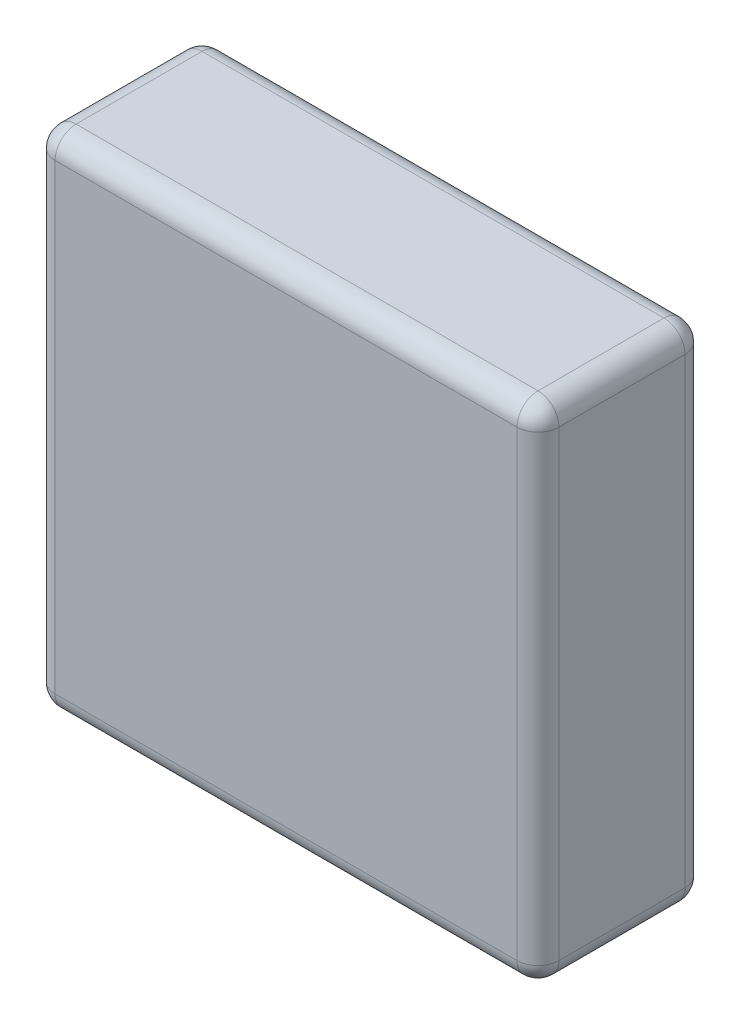
ISO-10303-21;
HEADER;
FILE_DESCRIPTION(('STEP AP214'),'2;1');
FILE_NAME('part.step','',(''),(''),'','','');
FILE_SCHEMA(('AUTOMOTIVE_DESIGN { 1 0 10303 214 1 1 1 1 }'));
ENDSEC;
DATA;
#1=APPLICATION_CONTEXT('core data for automotive mechanical design processes');
#2=APPLICATION_PROTOCOL_DEFINITION('international standard','automotive_design',2000,#1);
#3=PRODUCT_CONTEXT('',#1,'mechanical');
#4=PRODUCT('Part','Part','',(#3));
#5=PRODUCT_RELATED_PRODUCT_CATEGORY('part','',(#4));
#6=PRODUCT_DEFINITION_FORMATION('','',#4);
#7=PRODUCT_DEFINITION_CONTEXT('part definition',#1,'design');
#8=PRODUCT_DEFINITION('design','',#6,#7);
#9=PRODUCT_DEFINITION_SHAPE('','',#8);
#10=(LENGTH_UNIT() NAMED_UNIT(*) SI_UNIT(.MILLI.,.METRE.));
#11=(NAMED_UNIT(*) PLANE_ANGLE_UNIT() SI_UNIT($,.RADIAN.));
#12=(NAMED_UNIT(*) SI_UNIT($,.STERADIAN.) SOLID_ANGLE_UNIT());
#13=UNCERTAINTY_MEASURE_WITH_UNIT(LENGTH_MEASURE(1.E-05),#10,'distance_accuracy_value','');
#14=(GEOMETRIC_REPRESENTATION_CONTEXT(3) GLOBAL_UNCERTAINTY_ASSIGNED_CONTEXT((#13)) GLOBAL_UNIT_ASSIGNED_CONTEXT((#10,
#11,#12)) REPRESENTATION_CONTEXT('',''));
#15=CARTESIAN_POINT('',(0.,0.,0.));
#16=DIRECTION('',(0.,0.,1.));
#17=DIRECTION('',(1.,0.,0.));
#18=AXIS2_PLACEMENT_3D('',#15,#16,#17);
#19=CARTESIAN_POINT('',(0.,0.,40.));
#20=DIRECTION('',(1.,0.,0.));
#21=DIRECTION('',(0.,1.,0.));
#22=AXIS2_PLACEMENT_3D('',#19,#20,#21);
#23=PLANE('',#22);
#24=DIRECTION('',(0.,0.,-1.));
#25=VECTOR('',#24,1.);
#26=CARTESIAN_POINT('',(0.,-5.,40.));
#27=LINE('',#26,#25);
#28=CARTESIAN_POINT('',(0.,-5.,35.));
#29=VERTEX_POINT('',#28);
#30=CARTESIAN_POINT('',(0.,-5.,5.));
#31=VERTEX_POINT('',#30);
#32=EDGE_CURVE('E205',#29,#31,#27,.T.);
#33=ORIENTED_EDGE('',*,*,#32,.T.);
#34=DIRECTION('',(0.,-1.,0.));
#35=VECTOR('',#34,1.);
#36=CARTESIAN_POINT('',(0.,0.,5.));
#37=LINE('',#36,#35);
#38=CARTESIAN_POINT('',(0.,-115.,5.));
#39=VERTEX_POINT('',#38);
#40=EDGE_CURVE('E208',#31,#39,#37,.T.);
#41=ORIENTED_EDGE('',*,*,#40,.T.);
#42=DIRECTION('',(0.,0.,-1.));
#43=VECTOR('',#42,1.);
#44=CARTESIAN_POINT('',(0.,-115.,40.));
#45=LINE('',#44,#43);
#46=CARTESIAN_POINT('',(0.,-115.,35.));
#47=VERTEX_POINT('',#46);
#48=EDGE_CURVE('E203',#39,#47,#45,.F.);
#49=ORIENTED_EDGE('',*,*,#48,.T.);
#50=DIRECTION('',(0.,-1.,0.));
#51=VECTOR('',#50,1.);
#52=CARTESIAN_POINT('',(0.,0.,35.));
#53=LINE('',#52,#51);
#54=EDGE_CURVE('E201',#47,#29,#53,.F.);
#55=ORIENTED_EDGE('',*,*,#54,.T.);
#56=EDGE_LOOP('',(#33,#41,#49,#55));
#57=FACE_BOUND('',#56,.T.);
#58=ADVANCED_FACE('F43',(#57),#23,.F.);
#59=CARTESIAN_POINT('',(0.,-120.,40.));
#60=DIRECTION('',(0.,1.,0.));
#61=DIRECTION('',(0.,0.,1.));
#62=AXIS2_PLACEMENT_3D('',#59,#60,#61);
#63=PLANE('',#62);
#64=DIRECTION('',(1.,0.,0.));
#65=VECTOR('',#64,1.);
#66=CARTESIAN_POINT('',(0.,-120.,5.));
#67=LINE('',#66,#65);
#68=CARTESIAN_POINT('',(5.00000000000001,-120.,5.));
#69=VERTEX_POINT('',#68);
#70=CARTESIAN_POINT('',(115.,-120.,5.));
#71=VERTEX_POINT('',#70);
#72=EDGE_CURVE('E143',#69,#71,#67,.T.);
#73=ORIENTED_EDGE('',*,*,#72,.T.);
#74=DIRECTION('',(0.,0.,-1.));
#75=VECTOR('',#74,1.);
#76=CARTESIAN_POINT('',(115.,-120.,40.));
#77=LINE('',#76,#75);
#78=CARTESIAN_POINT('',(115.,-120.,35.));
#79=VERTEX_POINT('',#78);
#80=EDGE_CURVE('E139',#71,#79,#77,.F.);
#81=ORIENTED_EDGE('',*,*,#80,.T.);
#82=DIRECTION('',(1.,0.,0.));
#83=VECTOR('',#82,1.);
#84=CARTESIAN_POINT('',(0.,-120.,35.));
#85=LINE('',#84,#83);
#86=CARTESIAN_POINT('',(5.00000000000001,-120.,35.));
#87=VERTEX_POINT('',#86);
#88=EDGE_CURVE('E131',#79,#87,#85,.F.);
#89=ORIENTED_EDGE('',*,*,#88,.T.);
#90=DIRECTION('',(0.,0.,-1.));
#91=VECTOR('',#90,1.);
#92=CARTESIAN_POINT('',(5.00000000000001,-120.,40.));
#93=LINE('',#92,#91);
#94=EDGE_CURVE('E136',#87,#69,#93,.T.);
#95=ORIENTED_EDGE('',*,*,#94,.T.);
#96=EDGE_LOOP('',(#73,#81,#89,#95));
#97=FACE_BOUND('',#96,.T.);
#98=ADVANCED_FACE('F134',(#97),#63,.F.);
#99=CARTESIAN_POINT('',(120.,0.,40.));
#100=DIRECTION('',(-1.,0.,0.));
#101=DIRECTION('',(0.,-1.,0.));
#102=AXIS2_PLACEMENT_3D('',#99,#100,#101);
#103=PLANE('',#102);
#104=DIRECTION('',(0.,0.,-1.));
#105=VECTOR('',#104,1.);
#106=CARTESIAN_POINT('',(120.,-5.,40.));
#107=LINE('',#106,#105);
#108=CARTESIAN_POINT('',(120.,-5.,5.));
#109=VERTEX_POINT('',#108);
#110=CARTESIAN_POINT('',(120.,-5.,35.));
#111=VERTEX_POINT('',#110);
#112=EDGE_CURVE('E63',#109,#111,#107,.F.);
#113=ORIENTED_EDGE('',*,*,#112,.T.);
#114=DIRECTION('',(0.,1.,0.));
#115=VECTOR('',#114,1.);
#116=CARTESIAN_POINT('',(120.,-120.,35.));
#117=LINE('',#116,#115);
#118=CARTESIAN_POINT('',(120.,-115.,35.));
#119=VERTEX_POINT('',#118);
#120=EDGE_CURVE('E11',#111,#119,#117,.F.);
#121=ORIENTED_EDGE('',*,*,#120,.T.);
#122=DIRECTION('',(0.,0.,-1.));
#123=VECTOR('',#122,1.);
#124=CARTESIAN_POINT('',(120.,-115.,40.));
#125=LINE('',#124,#123);
#126=CARTESIAN_POINT('',(120.,-115.,5.));
#127=VERTEX_POINT('',#126);
#128=EDGE_CURVE('E52',#119,#127,#125,.T.);
#129=ORIENTED_EDGE('',*,*,#128,.T.);
#130=DIRECTION('',(0.,1.,0.));
#131=VECTOR('',#130,1.);
#132=CARTESIAN_POINT('',(120.,0.,5.));
#133=LINE('',#132,#131);
#134=EDGE_CURVE('E210',#127,#109,#133,.T.);
#135=ORIENTED_EDGE('',*,*,#134,.T.);
#136=EDGE_LOOP('',(#113,#121,#129,#135));
#137=FACE_BOUND('',#136,.T.);
#138=ADVANCED_FACE('F280',(#137),#103,.F.);
#139=CARTESIAN_POINT('',(0.,0.,40.));
#140=DIRECTION('',(0.,-1.,0.));
#141=DIRECTION('',(0.,0.,-1.));
#142=AXIS2_PLACEMENT_3D('',#139,#140,#141);
#143=PLANE('',#142);
#144=DIRECTION('',(0.,0.,-1.));
#145=VECTOR('',#144,1.);
#146=CARTESIAN_POINT('',(5.,0.,40.));
#147=LINE('',#146,#145);
#148=CARTESIAN_POINT('',(5.,0.,5.));
#149=VERTEX_POINT('',#148);
#150=CARTESIAN_POINT('',(5.,0.,35.));
#151=VERTEX_POINT('',#150);
#152=EDGE_CURVE('E196',#149,#151,#147,.F.);
#153=ORIENTED_EDGE('',*,*,#152,.T.);
#154=DIRECTION('',(-1.,0.,0.));
#155=VECTOR('',#154,1.);
#156=CARTESIAN_POINT('',(120.,0.,35.));
#157=LINE('',#156,#155);
#158=CARTESIAN_POINT('',(115.,0.,35.));
#159=VERTEX_POINT('',#158);
#160=EDGE_CURVE('E198',#151,#159,#157,.F.);
#161=ORIENTED_EDGE('',*,*,#160,.T.);
#162=DIRECTION('',(0.,0.,-1.));
#163=VECTOR('',#162,1.);
#164=CARTESIAN_POINT('',(115.,0.,40.));
#165=LINE('',#164,#163);
#166=CARTESIAN_POINT('',(115.,0.,5.));
#167=VERTEX_POINT('',#166);
#168=EDGE_CURVE('E194',#159,#167,#165,.T.);
#169=ORIENTED_EDGE('',*,*,#168,.T.);
#170=DIRECTION('',(-1.,0.,0.));
#171=VECTOR('',#170,1.);
#172=CARTESIAN_POINT('',(0.,0.,5.));
#173=LINE('',#172,#171);
#174=EDGE_CURVE('E192',#167,#149,#173,.T.);
#175=ORIENTED_EDGE('',*,*,#174,.T.);
#176=EDGE_LOOP('',(#153,#161,#169,#175));
#177=FACE_BOUND('',#176,.T.);
#178=ADVANCED_FACE('F303',(#177),#143,.F.);
#179=CARTESIAN_POINT('',(0.,0.,40.));
#180=DIRECTION('',(0.,0.,1.));
#181=DIRECTION('',(1.,0.,0.));
#182=AXIS2_PLACEMENT_3D('',#179,#180,#181);
#183=PLANE('',#182);
#184=DIRECTION('',(-1.,0.,0.));
#185=VECTOR('',#184,1.);
#186=CARTESIAN_POINT('',(0.,-5.,40.));
#187=LINE('',#186,#185);
#188=CARTESIAN_POINT('',(115.,-5.,40.));
#189=VERTEX_POINT('',#188);
#190=CARTESIAN_POINT('',(5.,-5.,40.));
#191=VERTEX_POINT('',#190);
#192=EDGE_CURVE('E187',#189,#191,#187,.T.);
#193=ORIENTED_EDGE('',*,*,#192,.T.);
#194=DIRECTION('',(0.,-1.,0.));
#195=VECTOR('',#194,1.);
#196=CARTESIAN_POINT('',(5.00000000000001,-120.,40.));
#197=LINE('',#196,#195);
#198=CARTESIAN_POINT('',(5.00000000000001,-115.,40.));
#199=VERTEX_POINT('',#198);
#200=EDGE_CURVE('E190',#191,#199,#197,.T.);
#201=ORIENTED_EDGE('',*,*,#200,.T.);
#202=DIRECTION('',(1.,0.,0.));
#203=VECTOR('',#202,1.);
#204=CARTESIAN_POINT('',(120.,-115.,40.));
#205=LINE('',#204,#203);
#206=CARTESIAN_POINT('',(115.,-115.,40.));
#207=VERTEX_POINT('',#206);
#208=EDGE_CURVE('E151',#199,#207,#205,.T.);
#209=ORIENTED_EDGE('',*,*,#208,.T.);
#210=DIRECTION('',(0.,1.,0.));
#211=VECTOR('',#210,1.);
#212=CARTESIAN_POINT('',(115.,0.,40.));
#213=LINE('',#212,#211);
#214=EDGE_CURVE('E185',#207,#189,#213,.T.);
#215=ORIENTED_EDGE('',*,*,#214,.T.);
#216=EDGE_LOOP('',(#193,#201,#209,#215));
#217=FACE_BOUND('',#216,.T.);
#218=ADVANCED_FACE('F315',(#217),#183,.T.);
#219=CARTESIAN_POINT('',(0.,0.,0.));
#220=DIRECTION('',(0.,0.,1.));
#221=DIRECTION('',(1.,0.,0.));
#222=AXIS2_PLACEMENT_3D('',#219,#220,#221);
#223=PLANE('',#222);
#224=DIRECTION('',(0.,1.,0.));
#225=VECTOR('',#224,1.);
#226=CARTESIAN_POINT('',(115.,0.,0.));
#227=LINE('',#226,#225);
#228=CARTESIAN_POINT('',(115.,-5.,0.));
#229=VERTEX_POINT('',#228);
#230=CARTESIAN_POINT('',(115.,-115.,0.));
#231=VERTEX_POINT('',#230);
#232=EDGE_CURVE('E178',#229,#231,#227,.F.);
#233=ORIENTED_EDGE('',*,*,#232,.T.);
#234=DIRECTION('',(1.,0.,0.));
#235=VECTOR('',#234,1.);
#236=CARTESIAN_POINT('',(0.,-115.,0.));
#237=LINE('',#236,#235);
#238=CARTESIAN_POINT('',(5.00000000000001,-115.,0.));
#239=VERTEX_POINT('',#238);
#240=EDGE_CURVE('E182',#231,#239,#237,.F.);
#241=ORIENTED_EDGE('',*,*,#240,.T.);
#242=DIRECTION('',(0.,-1.,0.));
#243=VECTOR('',#242,1.);
#244=CARTESIAN_POINT('',(5.,0.,0.));
#245=LINE('',#244,#243);
#246=CARTESIAN_POINT('',(5.,-5.,0.));
#247=VERTEX_POINT('',#246);
#248=EDGE_CURVE('E180',#239,#247,#245,.F.);
#249=ORIENTED_EDGE('',*,*,#248,.T.);
#250=DIRECTION('',(-1.,0.,0.));
#251=VECTOR('',#250,1.);
#252=CARTESIAN_POINT('',(0.,-5.,0.));
#253=LINE('',#252,#251);
#254=EDGE_CURVE('E176',#247,#229,#253,.F.);
#255=ORIENTED_EDGE('',*,*,#254,.T.);
#256=EDGE_LOOP('',(#233,#241,#249,#255));
#257=FACE_BOUND('',#256,.T.);
#258=ADVANCED_FACE('F294',(#257),#223,.F.);
#259=CARTESIAN_POINT('',(0.,-5.,35.));
#260=DIRECTION('',(1.,0.,0.));
#261=DIRECTION('',(0.,0.,-1.));
#262=AXIS2_PLACEMENT_3D('',#259,#260,#261);
#263=CYLINDRICAL_SURFACE('',#262,5.);
#264=CARTESIAN_POINT('',(5.,-5.,35.));
#265=DIRECTION('',(-1.,0.,0.));
#266=DIRECTION('',(0.,0.,1.));
#267=AXIS2_PLACEMENT_3D('',#264,#265,#266);
#268=CIRCLE('',#267,5.);
#269=EDGE_CURVE('E47',#191,#151,#268,.T.);
#270=ORIENTED_EDGE('',*,*,#269,.F.);
#271=ORIENTED_EDGE('',*,*,#192,.F.);
#272=CARTESIAN_POINT('',(115.,-5.,35.));
#273=DIRECTION('',(1.,0.,0.));
#274=DIRECTION('',(0.,0.,-1.));
#275=AXIS2_PLACEMENT_3D('',#272,#273,#274);
#276=CIRCLE('',#275,5.);
#277=EDGE_CURVE('E172',#159,#189,#276,.T.);
#278=ORIENTED_EDGE('',*,*,#277,.F.);
#279=ORIENTED_EDGE('',*,*,#160,.F.);
#280=EDGE_LOOP('',(#270,#271,#278,#279));
#281=FACE_BOUND('',#280,.T.);
#282=ADVANCED_FACE('F45',(#281),#263,.T.);
#283=CARTESIAN_POINT('',(5.,-5.,35.));
#284=DIRECTION('',(0.,1.,0.));
#285=DIRECTION('',(0.,0.,1.));
#286=AXIS2_PLACEMENT_3D('',#283,#284,#285);
#287=SPHERICAL_SURFACE('',#286,5.);
#288=CARTESIAN_POINT('',(5.,-5.,35.));
#289=DIRECTION('',(0.,1.,0.));
#290=DIRECTION('',(-1.,0.,0.));
#291=AXIS2_PLACEMENT_3D('',#288,#289,#290);
#292=CIRCLE('',#291,5.);
#293=EDGE_CURVE('E255',#191,#29,#292,.F.);
#294=ORIENTED_EDGE('',*,*,#293,.F.);
#295=ORIENTED_EDGE('',*,*,#269,.T.);
#296=CARTESIAN_POINT('',(5.,-5.,35.));
#297=DIRECTION('',(0.,0.,1.));
#298=DIRECTION('',(1.,0.,0.));
#299=AXIS2_PLACEMENT_3D('',#296,#297,#298);
#300=CIRCLE('',#299,5.);
#301=EDGE_CURVE('E258',#29,#151,#300,.F.);
#302=ORIENTED_EDGE('',*,*,#301,.F.);
#303=EDGE_LOOP('',(#294,#295,#302));
#304=FACE_BOUND('',#303,.T.);
#305=ADVANCED_FACE('F311',(#304),#287,.T.);
#306=CARTESIAN_POINT('',(115.,-5.,35.));
#307=DIRECTION('',(0.,0.,1.));
#308=DIRECTION('',(1.,0.,0.));
#309=AXIS2_PLACEMENT_3D('',#306,#307,#308);
#310=SPHERICAL_SURFACE('',#309,5.);
#311=CARTESIAN_POINT('',(115.,-5.,35.));
#312=DIRECTION('',(0.,0.,1.));
#313=DIRECTION('',(1.,0.,0.));
#314=AXIS2_PLACEMENT_3D('',#311,#312,#313);
#315=CIRCLE('',#314,5.);
#316=EDGE_CURVE('E250',#159,#111,#315,.F.);
#317=ORIENTED_EDGE('',*,*,#316,.F.);
#318=ORIENTED_EDGE('',*,*,#277,.T.);
#319=CARTESIAN_POINT('',(115.,-5.,35.));
#320=DIRECTION('',(0.,1.,0.));
#321=DIRECTION('',(-1.,0.,0.));
#322=AXIS2_PLACEMENT_3D('',#319,#320,#321);
#323=CIRCLE('',#322,5.);
#324=EDGE_CURVE('E252',#111,#189,#323,.F.);
#325=ORIENTED_EDGE('',*,*,#324,.F.);
#326=EDGE_LOOP('',(#317,#318,#325));
#327=FACE_BOUND('',#326,.T.);
#328=ADVANCED_FACE('F265',(#327),#310,.T.);
#329=CARTESIAN_POINT('',(5.,-5.,40.));
#330=DIRECTION('',(0.,0.,-1.));
#331=DIRECTION('',(-1.,0.,0.));
#332=AXIS2_PLACEMENT_3D('',#329,#330,#331);
#333=CYLINDRICAL_SURFACE('',#332,5.);
#334=ORIENTED_EDGE('',*,*,#301,.T.);
#335=ORIENTED_EDGE('',*,*,#152,.F.);
#336=CARTESIAN_POINT('',(5.,-5.,5.));
#337=DIRECTION('',(0.,0.,-1.));
#338=DIRECTION('',(-1.,0.,0.));
#339=AXIS2_PLACEMENT_3D('',#336,#337,#338);
#340=CIRCLE('',#339,5.);
#341=EDGE_CURVE('E244',#31,#149,#340,.T.);
#342=ORIENTED_EDGE('',*,*,#341,.F.);
#343=ORIENTED_EDGE('',*,*,#32,.F.);
#344=EDGE_LOOP('',(#334,#335,#342,#343));
#345=FACE_BOUND('',#344,.T.);
#346=ADVANCED_FACE('F306',(#345),#333,.T.);
#347=CARTESIAN_POINT('',(5.,0.,35.));
#348=DIRECTION('',(0.,1.,0.));
#349=DIRECTION('',(-1.,0.,0.));
#350=AXIS2_PLACEMENT_3D('',#347,#348,#349);
#351=CYLINDRICAL_SURFACE('',#350,5.);
#352=ORIENTED_EDGE('',*,*,#293,.T.);
#353=ORIENTED_EDGE('',*,*,#54,.F.);
#354=CARTESIAN_POINT('',(5.00000000000001,-115.,35.));
#355=DIRECTION('',(0.,-1.,0.));
#356=DIRECTION('',(0.,0.,-1.));
#357=AXIS2_PLACEMENT_3D('',#354,#355,#356);
#358=CIRCLE('',#357,5.);
#359=EDGE_CURVE('E155',#199,#47,#358,.T.);
#360=ORIENTED_EDGE('',*,*,#359,.F.);
#361=ORIENTED_EDGE('',*,*,#200,.F.);
#362=EDGE_LOOP('',(#352,#353,#360,#361));
#363=FACE_BOUND('',#362,.T.);
#364=ADVANCED_FACE('F317',(#363),#351,.T.);
#365=CARTESIAN_POINT('',(0.,-115.,35.));
#366=DIRECTION('',(-1.,0.,0.));
#367=DIRECTION('',(0.,0.,1.));
#368=AXIS2_PLACEMENT_3D('',#365,#366,#367);
#369=CYLINDRICAL_SURFACE('',#368,5.);
#370=CARTESIAN_POINT('',(115.,-115.,35.));
#371=DIRECTION('',(1.,0.,0.));
#372=DIRECTION('',(0.,0.,-1.));
#373=AXIS2_PLACEMENT_3D('',#370,#371,#372);
#374=CIRCLE('',#373,5.);
#375=EDGE_CURVE('E156',#207,#79,#374,.T.);
#376=ORIENTED_EDGE('',*,*,#375,.F.);
#377=ORIENTED_EDGE('',*,*,#208,.F.);
#378=CARTESIAN_POINT('',(5.00000000000001,-115.,35.));
#379=DIRECTION('',(-1.,0.,0.));
#380=DIRECTION('',(0.,0.,1.));
#381=AXIS2_PLACEMENT_3D('',#378,#379,#380);
#382=CIRCLE('',#381,5.);
#383=EDGE_CURVE('E147',#87,#199,#382,.T.);
#384=ORIENTED_EDGE('',*,*,#383,.F.);
#385=ORIENTED_EDGE('',*,*,#88,.F.);
#386=EDGE_LOOP('',(#376,#377,#384,#385));
#387=FACE_BOUND('',#386,.T.);
#388=ADVANCED_FACE('F149',(#387),#369,.T.);
#389=CARTESIAN_POINT('',(115.,0.,35.));
#390=DIRECTION('',(0.,-1.,0.));
#391=DIRECTION('',(1.,0.,0.));
#392=AXIS2_PLACEMENT_3D('',#389,#390,#391);
#393=CYLINDRICAL_SURFACE('',#392,5.);
#394=ORIENTED_EDGE('',*,*,#324,.T.);
#395=ORIENTED_EDGE('',*,*,#214,.F.);
#396=CARTESIAN_POINT('',(115.,-115.,35.));
#397=DIRECTION('',(0.,-1.,0.));
#398=DIRECTION('',(0.,0.,-1.));
#399=AXIS2_PLACEMENT_3D('',#396,#397,#398);
#400=CIRCLE('',#399,5.);
#401=EDGE_CURVE('E240',#119,#207,#400,.T.);
#402=ORIENTED_EDGE('',*,*,#401,.F.);
#403=ORIENTED_EDGE('',*,*,#120,.F.);
#404=EDGE_LOOP('',(#394,#395,#402,#403));
#405=FACE_BOUND('',#404,.T.);
#406=ADVANCED_FACE('F271',(#405),#393,.T.);
#407=CARTESIAN_POINT('',(115.,-5.,40.));
#408=DIRECTION('',(0.,0.,-1.));
#409=DIRECTION('',(-1.,0.,0.));
#410=AXIS2_PLACEMENT_3D('',#407,#408,#409);
#411=CYLINDRICAL_SURFACE('',#410,5.);
#412=ORIENTED_EDGE('',*,*,#316,.T.);
#413=ORIENTED_EDGE('',*,*,#112,.F.);
#414=CARTESIAN_POINT('',(115.,-5.,5.));
#415=DIRECTION('',(0.,0.,-1.));
#416=DIRECTION('',(-1.,0.,0.));
#417=AXIS2_PLACEMENT_3D('',#414,#415,#416);
#418=CIRCLE('',#417,5.);
#419=EDGE_CURVE('E237',#167,#109,#418,.T.);
#420=ORIENTED_EDGE('',*,*,#419,.F.);
#421=ORIENTED_EDGE('',*,*,#168,.F.);
#422=EDGE_LOOP('',(#412,#413,#420,#421));
#423=FACE_BOUND('',#422,.T.);
#424=ADVANCED_FACE('F285',(#423),#411,.T.);
#425=CARTESIAN_POINT('',(0.,-5.,5.));
#426=DIRECTION('',(-1.,0.,0.));
#427=DIRECTION('',(0.,0.,1.));
#428=AXIS2_PLACEMENT_3D('',#425,#426,#427);
#429=CYLINDRICAL_SURFACE('',#428,5.);
#430=CARTESIAN_POINT('',(5.,-5.,5.));
#431=DIRECTION('',(-1.,0.,0.));
#432=DIRECTION('',(0.,0.,1.));
#433=AXIS2_PLACEMENT_3D('',#430,#431,#432);
#434=CIRCLE('',#433,5.);
#435=EDGE_CURVE('E247',#149,#247,#434,.T.);
#436=ORIENTED_EDGE('',*,*,#435,.F.);
#437=ORIENTED_EDGE('',*,*,#174,.F.);
#438=CARTESIAN_POINT('',(115.,-5.,5.));
#439=DIRECTION('',(1.,0.,0.));
#440=DIRECTION('',(0.,0.,-1.));
#441=AXIS2_PLACEMENT_3D('',#438,#439,#440);
#442=CIRCLE('',#441,5.);
#443=EDGE_CURVE('E234',#229,#167,#442,.T.);
#444=ORIENTED_EDGE('',*,*,#443,.F.);
#445=ORIENTED_EDGE('',*,*,#254,.F.);
#446=EDGE_LOOP('',(#436,#437,#444,#445));
#447=FACE_BOUND('',#446,.T.);
#448=ADVANCED_FACE('F300',(#447),#429,.T.);
#449=CARTESIAN_POINT('',(5.,-5.,5.));
#450=DIRECTION('',(0.,1.,0.));
#451=DIRECTION('',(0.,0.,1.));
#452=AXIS2_PLACEMENT_3D('',#449,#450,#451);
#453=SPHERICAL_SURFACE('',#452,5.);
#454=ORIENTED_EDGE('',*,*,#341,.T.);
#455=ORIENTED_EDGE('',*,*,#435,.T.);
#456=CARTESIAN_POINT('',(5.,-5.,5.));
#457=DIRECTION('',(0.,1.,0.));
#458=DIRECTION('',(-1.,0.,0.));
#459=AXIS2_PLACEMENT_3D('',#456,#457,#458);
#460=CIRCLE('',#459,5.);
#461=EDGE_CURVE('E163',#31,#247,#460,.F.);
#462=ORIENTED_EDGE('',*,*,#461,.F.);
#463=EDGE_LOOP('',(#454,#455,#462));
#464=FACE_BOUND('',#463,.T.);
#465=ADVANCED_FACE('F424',(#464),#453,.T.);
#466=CARTESIAN_POINT('',(5.00000000000001,-115.,35.));
#467=DIRECTION('',(0.,0.,1.));
#468=DIRECTION('',(1.,0.,0.));
#469=AXIS2_PLACEMENT_3D('',#466,#467,#468);
#470=SPHERICAL_SURFACE('',#469,5.);
#471=ORIENTED_EDGE('',*,*,#383,.T.);
#472=ORIENTED_EDGE('',*,*,#359,.T.);
#473=CARTESIAN_POINT('',(5.00000000000001,-115.,35.));
#474=DIRECTION('',(0.,0.,1.));
#475=DIRECTION('',(1.,0.,0.));
#476=AXIS2_PLACEMENT_3D('',#473,#474,#475);
#477=CIRCLE('',#476,5.);
#478=EDGE_CURVE('E159',#87,#47,#477,.F.);
#479=ORIENTED_EDGE('',*,*,#478,.F.);
#480=EDGE_LOOP('',(#471,#472,#479));
#481=FACE_BOUND('',#480,.T.);
#482=ADVANCED_FACE('F160',(#481),#470,.T.);
#483=CARTESIAN_POINT('',(115.,-115.,35.));
#484=DIRECTION('',(0.,0.,1.));
#485=DIRECTION('',(1.,0.,0.));
#486=AXIS2_PLACEMENT_3D('',#483,#484,#485);
#487=SPHERICAL_SURFACE('',#486,5.);
#488=ORIENTED_EDGE('',*,*,#401,.T.);
#489=ORIENTED_EDGE('',*,*,#375,.T.);
#490=CARTESIAN_POINT('',(115.,-115.,35.));
#491=DIRECTION('',(0.,0.,1.));
#492=DIRECTION('',(1.,0.,0.));
#493=AXIS2_PLACEMENT_3D('',#490,#491,#492);
#494=CIRCLE('',#493,5.);
#495=EDGE_CURVE('E164',#119,#79,#494,.F.);
#496=ORIENTED_EDGE('',*,*,#495,.F.);
#497=EDGE_LOOP('',(#488,#489,#496));
#498=FACE_BOUND('',#497,.T.);
#499=ADVANCED_FACE('F275',(#498),#487,.T.);
#500=CARTESIAN_POINT('',(115.,-5.,5.));
#501=DIRECTION('',(0.,1.,0.));
#502=DIRECTION('',(0.,0.,1.));
#503=AXIS2_PLACEMENT_3D('',#500,#501,#502);
#504=SPHERICAL_SURFACE('',#503,5.);
#505=ORIENTED_EDGE('',*,*,#443,.T.);
#506=ORIENTED_EDGE('',*,*,#419,.T.);
#507=CARTESIAN_POINT('',(115.,-5.,5.));
#508=DIRECTION('',(0.,1.,0.));
#509=DIRECTION('',(-1.,0.,0.));
#510=AXIS2_PLACEMENT_3D('',#507,#508,#509);
#511=CIRCLE('',#510,5.);
#512=EDGE_CURVE('E227',#229,#109,#511,.F.);
#513=ORIENTED_EDGE('',*,*,#512,.F.);
#514=EDGE_LOOP('',(#505,#506,#513));
#515=FACE_BOUND('',#514,.T.);
#516=ADVANCED_FACE('F288',(#515),#504,.T.);
#517=CARTESIAN_POINT('',(5.,0.,5.));
#518=DIRECTION('',(0.,-1.,0.));
#519=DIRECTION('',(1.,0.,0.));
#520=AXIS2_PLACEMENT_3D('',#517,#518,#519);
#521=CYLINDRICAL_SURFACE('',#520,5.);
#522=ORIENTED_EDGE('',*,*,#461,.T.);
#523=ORIENTED_EDGE('',*,*,#248,.F.);
#524=CARTESIAN_POINT('',(5.00000000000001,-115.,5.));
#525=DIRECTION('',(0.,-1.,0.));
#526=DIRECTION('',(0.,0.,-1.));
#527=AXIS2_PLACEMENT_3D('',#524,#525,#526);
#528=CIRCLE('',#527,5.);
#529=EDGE_CURVE('E224',#39,#239,#528,.T.);
#530=ORIENTED_EDGE('',*,*,#529,.F.);
#531=ORIENTED_EDGE('',*,*,#40,.F.);
#532=EDGE_LOOP('',(#522,#523,#530,#531));
#533=FACE_BOUND('',#532,.T.);
#534=ADVANCED_FACE('F322',(#533),#521,.T.);
#535=CARTESIAN_POINT('',(5.00000000000001,-115.,40.));
#536=DIRECTION('',(0.,0.,-1.));
#537=DIRECTION('',(-1.,0.,0.));
#538=AXIS2_PLACEMENT_3D('',#535,#536,#537);
#539=CYLINDRICAL_SURFACE('',#538,5.);
#540=ORIENTED_EDGE('',*,*,#478,.T.);
#541=ORIENTED_EDGE('',*,*,#48,.F.);
#542=CARTESIAN_POINT('',(5.00000000000001,-115.,5.));
#543=DIRECTION('',(0.,0.,-1.));
#544=DIRECTION('',(-1.,0.,0.));
#545=AXIS2_PLACEMENT_3D('',#542,#543,#544);
#546=CIRCLE('',#545,5.);
#547=EDGE_CURVE('E168',#69,#39,#546,.T.);
#548=ORIENTED_EDGE('',*,*,#547,.F.);
#549=ORIENTED_EDGE('',*,*,#94,.F.);
#550=EDGE_LOOP('',(#540,#541,#548,#549));
#551=FACE_BOUND('',#550,.T.);
#552=ADVANCED_FACE('F166',(#551),#539,.T.);
#553=CARTESIAN_POINT('',(115.,-115.,40.));
#554=DIRECTION('',(0.,0.,-1.));
#555=DIRECTION('',(-1.,0.,0.));
#556=AXIS2_PLACEMENT_3D('',#553,#554,#555);
#557=CYLINDRICAL_SURFACE('',#556,5.);
#558=ORIENTED_EDGE('',*,*,#495,.T.);
#559=ORIENTED_EDGE('',*,*,#80,.F.);
#560=CARTESIAN_POINT('',(115.,-115.,5.));
#561=DIRECTION('',(0.,0.,-1.));
#562=DIRECTION('',(-1.,0.,0.));
#563=AXIS2_PLACEMENT_3D('',#560,#561,#562);
#564=CIRCLE('',#563,5.);
#565=EDGE_CURVE('E220',#127,#71,#564,.T.);
#566=ORIENTED_EDGE('',*,*,#565,.F.);
#567=ORIENTED_EDGE('',*,*,#128,.F.);
#568=EDGE_LOOP('',(#558,#559,#566,#567));
#569=FACE_BOUND('',#568,.T.);
#570=ADVANCED_FACE('F278',(#569),#557,.T.);
#571=CARTESIAN_POINT('',(115.,0.,5.));
#572=DIRECTION('',(0.,1.,0.));
#573=DIRECTION('',(-1.,0.,0.));
#574=AXIS2_PLACEMENT_3D('',#571,#572,#573);
#575=CYLINDRICAL_SURFACE('',#574,5.);
#576=ORIENTED_EDGE('',*,*,#512,.T.);
#577=ORIENTED_EDGE('',*,*,#134,.F.);
#578=CARTESIAN_POINT('',(115.,-115.,5.));
#579=DIRECTION('',(0.,-1.,0.));
#580=DIRECTION('',(0.,0.,-1.));
#581=AXIS2_PLACEMENT_3D('',#578,#579,#580);
#582=CIRCLE('',#581,5.);
#583=EDGE_CURVE('E218',#231,#127,#582,.T.);
#584=ORIENTED_EDGE('',*,*,#583,.F.);
#585=ORIENTED_EDGE('',*,*,#232,.F.);
#586=EDGE_LOOP('',(#576,#577,#584,#585));
#587=FACE_BOUND('',#586,.T.);
#588=ADVANCED_FACE('F291',(#587),#575,.T.);
#589=CARTESIAN_POINT('',(5.00000000000001,-115.,5.));
#590=DIRECTION('',(-1.,0.,0.));
#591=DIRECTION('',(0.,0.,1.));
#592=AXIS2_PLACEMENT_3D('',#589,#590,#591);
#593=SPHERICAL_SURFACE('',#592,5.);
#594=ORIENTED_EDGE('',*,*,#547,.T.);
#595=ORIENTED_EDGE('',*,*,#529,.T.);
#596=CARTESIAN_POINT('',(5.00000000000001,-115.,5.));
#597=DIRECTION('',(-1.,0.,0.));
#598=DIRECTION('',(0.,0.,1.));
#599=AXIS2_PLACEMENT_3D('',#596,#597,#598);
#600=CIRCLE('',#599,5.);
#601=EDGE_CURVE('E216',#69,#239,#600,.F.);
#602=ORIENTED_EDGE('',*,*,#601,.F.);
#603=EDGE_LOOP('',(#594,#595,#602));
#604=FACE_BOUND('',#603,.T.);
#605=ADVANCED_FACE('F325',(#604),#593,.T.);
#606=CARTESIAN_POINT('',(115.,-115.,5.));
#607=DIRECTION('',(1.,0.,0.));
#608=DIRECTION('',(0.,0.,-1.));
#609=AXIS2_PLACEMENT_3D('',#606,#607,#608);
#610=SPHERICAL_SURFACE('',#609,5.);
#611=ORIENTED_EDGE('',*,*,#583,.T.);
#612=ORIENTED_EDGE('',*,*,#565,.T.);
#613=CARTESIAN_POINT('',(115.,-115.,5.));
#614=DIRECTION('',(1.,0.,0.));
#615=DIRECTION('',(0.,0.,-1.));
#616=AXIS2_PLACEMENT_3D('',#613,#614,#615);
#617=CIRCLE('',#616,5.);
#618=EDGE_CURVE('E214',#231,#71,#617,.F.);
#619=ORIENTED_EDGE('',*,*,#618,.F.);
#620=EDGE_LOOP('',(#611,#612,#619));
#621=FACE_BOUND('',#620,.T.);
#622=ADVANCED_FACE('F331',(#621),#610,.T.);
#623=CARTESIAN_POINT('',(0.,-115.,5.));
#624=DIRECTION('',(1.,0.,0.));
#625=DIRECTION('',(0.,0.,-1.));
#626=AXIS2_PLACEMENT_3D('',#623,#624,#625);
#627=CYLINDRICAL_SURFACE('',#626,5.);
#628=ORIENTED_EDGE('',*,*,#601,.T.);
#629=ORIENTED_EDGE('',*,*,#240,.F.);
#630=ORIENTED_EDGE('',*,*,#618,.T.);
#631=ORIENTED_EDGE('',*,*,#72,.F.);
#632=EDGE_LOOP('',(#628,#629,#630,#631));
#633=FACE_BOUND('',#632,.T.);
#634=ADVANCED_FACE('F328',(#633),#627,.T.);
#635=CLOSED_SHELL('',(#58,#98,#138,#178,#218,#258,#282,#305,#328,#346,#364,#388,#406,#424,#448,
#465,#482,#499,#516,#534,#552,#570,#588,#605,#622,#634));
#636=MANIFOLD_SOLID_BREP('B2',#635);
#637=ADVANCED_BREP_SHAPE_REPRESENTATION('',(#18,#636),#14);
#638=SHAPE_DEFINITION_REPRESENTATION(#9,#637);
ENDSEC;
END-ISO-10303-21;
